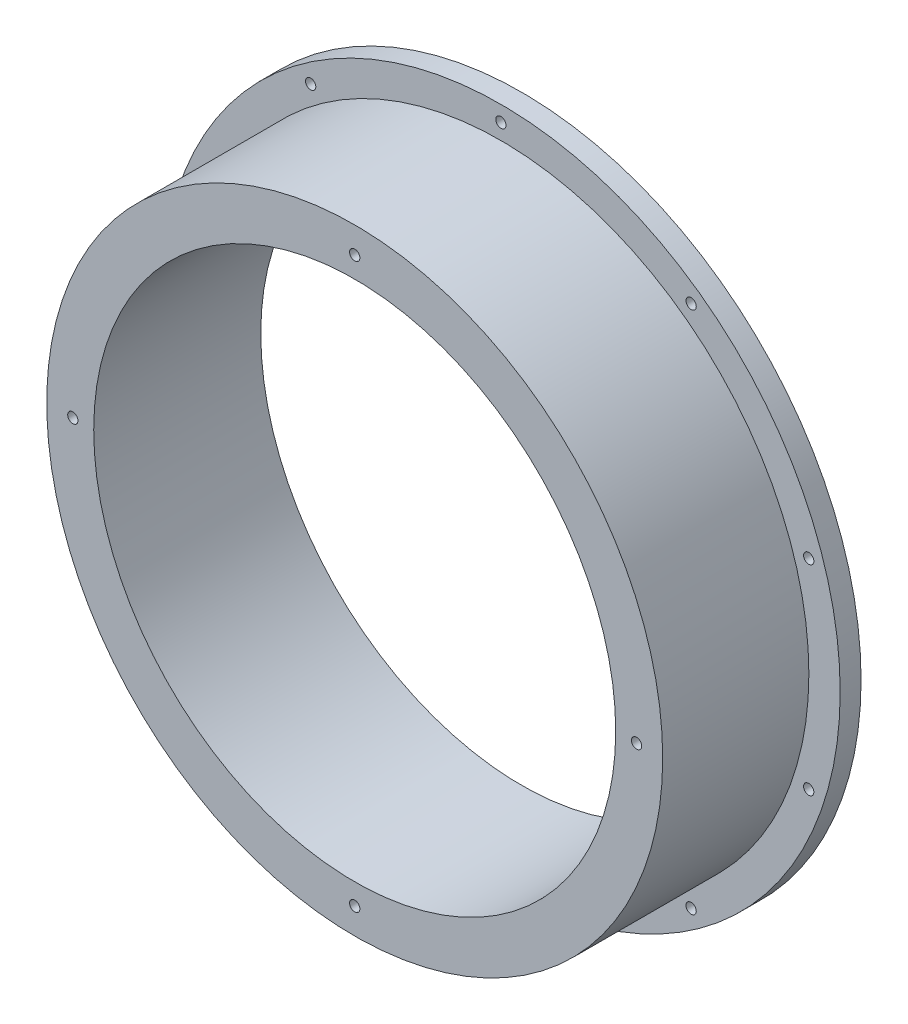
ISO-10303-21;
HEADER;
FILE_DESCRIPTION(('STEP AP214'),'2;1');
FILE_NAME('part.step','',(''),(''),'','','');
FILE_SCHEMA(('AUTOMOTIVE_DESIGN { 1 0 10303 214 1 1 1 1 }'));
ENDSEC;
DATA;
#1=APPLICATION_CONTEXT('core data for automotive mechanical design processes');
#2=APPLICATION_PROTOCOL_DEFINITION('international standard','automotive_design',2000,#1);
#3=PRODUCT_CONTEXT('',#1,'mechanical');
#4=PRODUCT('Part','Part','',(#3));
#5=PRODUCT_RELATED_PRODUCT_CATEGORY('part','',(#4));
#6=PRODUCT_DEFINITION_FORMATION('','',#4);
#7=PRODUCT_DEFINITION_CONTEXT('part definition',#1,'design');
#8=PRODUCT_DEFINITION('design','',#6,#7);
#9=PRODUCT_DEFINITION_SHAPE('','',#8);
#10=(LENGTH_UNIT() NAMED_UNIT(*) SI_UNIT(.MILLI.,.METRE.));
#11=(NAMED_UNIT(*) PLANE_ANGLE_UNIT() SI_UNIT($,.RADIAN.));
#12=(NAMED_UNIT(*) SI_UNIT($,.STERADIAN.) SOLID_ANGLE_UNIT());
#13=UNCERTAINTY_MEASURE_WITH_UNIT(LENGTH_MEASURE(1.E-05),#10,'distance_accuracy_value','');
#14=(GEOMETRIC_REPRESENTATION_CONTEXT(3) GLOBAL_UNCERTAINTY_ASSIGNED_CONTEXT((#13)) GLOBAL_UNIT_ASSIGNED_CONTEXT((#10,
#11,#12)) REPRESENTATION_CONTEXT('',''));
#15=CARTESIAN_POINT('',(0.,0.,0.));
#16=DIRECTION('',(0.,0.,1.));
#17=DIRECTION('',(1.,0.,0.));
#18=AXIS2_PLACEMENT_3D('',#15,#16,#17);
#19=CARTESIAN_POINT('',(0.,0.,0.));
#20=DIRECTION('',(0.,0.,1.));
#21=DIRECTION('',(1.,0.,0.));
#22=AXIS2_PLACEMENT_3D('',#19,#20,#21);
#23=CYLINDRICAL_SURFACE('',#22,82.55);
#24=CARTESIAN_POINT('',(0.,0.,-20.32));
#25=DIRECTION('',(0.,0.,1.));
#26=DIRECTION('',(1.,0.,0.));
#27=AXIS2_PLACEMENT_3D('',#24,#25,#26);
#28=CIRCLE('',#27,82.55);
#29=CARTESIAN_POINT('',(82.55,0.,-20.32));
#30=VERTEX_POINT('',#29);
#31=EDGE_CURVE('E104',#30,#30,#28,.T.);
#32=ORIENTED_EDGE('',*,*,#31,.T.);
#33=EDGE_LOOP('',(#32));
#34=FACE_BOUND('',#33,.T.);
#35=CARTESIAN_POINT('',(0.,0.,-15.24));
#36=DIRECTION('',(0.,0.,1.));
#37=DIRECTION('',(1.,0.,0.));
#38=AXIS2_PLACEMENT_3D('',#35,#36,#37);
#39=CIRCLE('',#38,82.55);
#40=CARTESIAN_POINT('',(82.55,0.,-15.24));
#41=VERTEX_POINT('',#40);
#42=EDGE_CURVE('E11',#41,#41,#39,.T.);
#43=ORIENTED_EDGE('',*,*,#42,.F.);
#44=EDGE_LOOP('',(#43));
#45=FACE_BOUND('',#44,.T.);
#46=ADVANCED_FACE('F42',(#34,#45),#23,.T.);
#47=CARTESIAN_POINT('',(82.55,0.,-15.24));
#48=DIRECTION('',(0.,0.,1.));
#49=DIRECTION('',(1.,0.,0.));
#50=AXIS2_PLACEMENT_3D('',#47,#48,#49);
#51=PLANE('',#50);
#52=CARTESIAN_POINT('',(0.,78.74,-15.24));
#53=DIRECTION('',(0.,0.,1.));
#54=DIRECTION('',(1.,0.,0.));
#55=AXIS2_PLACEMENT_3D('',#52,#53,#54);
#56=CIRCLE('',#55,1.25);
#57=CARTESIAN_POINT('',(1.25,78.74,-15.24));
#58=VERTEX_POINT('',#57);
#59=EDGE_CURVE('E103',#58,#58,#56,.T.);
#60=ORIENTED_EDGE('',*,*,#59,.F.);
#61=EDGE_LOOP('',(#60));
#62=FACE_BOUND('',#61,.T.);
#63=CARTESIAN_POINT('',(46.2822107655093,63.7019981370834,-15.24));
#64=DIRECTION('',(0.,0.,1.));
#65=DIRECTION('',(1.,0.,0.));
#66=AXIS2_PLACEMENT_3D('',#63,#64,#65);
#67=CIRCLE('',#66,1.25);
#68=CARTESIAN_POINT('',(47.5322107655093,63.7019981370834,-15.24));
#69=VERTEX_POINT('',#68);
#70=EDGE_CURVE('E316',#69,#69,#67,.T.);
#71=ORIENTED_EDGE('',*,*,#70,.F.);
#72=EDGE_LOOP('',(#71));
#73=FACE_BOUND('',#72,.T.);
#74=CARTESIAN_POINT('',(74.8861900930804,24.3319981370833,-15.24));
#75=DIRECTION('',(0.,0.,1.));
#76=DIRECTION('',(1.,0.,0.));
#77=AXIS2_PLACEMENT_3D('',#74,#75,#76);
#78=CIRCLE('',#77,1.25);
#79=CARTESIAN_POINT('',(76.1361900930804,24.3319981370833,-15.24));
#80=VERTEX_POINT('',#79);
#81=EDGE_CURVE('E327',#80,#80,#78,.T.);
#82=ORIENTED_EDGE('',*,*,#81,.F.);
#83=EDGE_LOOP('',(#82));
#84=FACE_BOUND('',#83,.T.);
#85=CARTESIAN_POINT('',(74.8861900930804,-24.3319981370834,-15.24));
#86=DIRECTION('',(0.,0.,1.));
#87=DIRECTION('',(1.,0.,0.));
#88=AXIS2_PLACEMENT_3D('',#85,#86,#87);
#89=CIRCLE('',#88,1.25);
#90=CARTESIAN_POINT('',(76.1361900930804,-24.3319981370834,-15.24));
#91=VERTEX_POINT('',#90);
#92=EDGE_CURVE('E341',#91,#91,#89,.T.);
#93=ORIENTED_EDGE('',*,*,#92,.F.);
#94=EDGE_LOOP('',(#93));
#95=FACE_BOUND('',#94,.T.);
#96=CARTESIAN_POINT('',(46.2822107655093,-63.7019981370834,-15.24));
#97=DIRECTION('',(0.,0.,1.));
#98=DIRECTION('',(1.,0.,0.));
#99=AXIS2_PLACEMENT_3D('',#96,#97,#98);
#100=CIRCLE('',#99,1.25);
#101=CARTESIAN_POINT('',(47.5322107655093,-63.7019981370834,-15.24));
#102=VERTEX_POINT('',#101);
#103=EDGE_CURVE('E336',#102,#102,#100,.T.);
#104=ORIENTED_EDGE('',*,*,#103,.F.);
#105=EDGE_LOOP('',(#104));
#106=FACE_BOUND('',#105,.T.);
#107=CARTESIAN_POINT('',(0.,-78.74,-15.24));
#108=DIRECTION('',(0.,0.,1.));
#109=DIRECTION('',(1.,0.,0.));
#110=AXIS2_PLACEMENT_3D('',#107,#108,#109);
#111=CIRCLE('',#110,1.25);
#112=CARTESIAN_POINT('',(1.24999999999999,-78.74,-15.24));
#113=VERTEX_POINT('',#112);
#114=EDGE_CURVE('E134',#113,#113,#111,.T.);
#115=ORIENTED_EDGE('',*,*,#114,.F.);
#116=EDGE_LOOP('',(#115));
#117=FACE_BOUND('',#116,.T.);
#118=CARTESIAN_POINT('',(-46.2822107655093,-63.7019981370833,-15.24));
#119=DIRECTION('',(0.,0.,1.));
#120=DIRECTION('',(1.,0.,0.));
#121=AXIS2_PLACEMENT_3D('',#118,#119,#120);
#122=CIRCLE('',#121,1.25);
#123=CARTESIAN_POINT('',(-45.0322107655093,-63.7019981370833,-15.24));
#124=VERTEX_POINT('',#123);
#125=EDGE_CURVE('E128',#124,#124,#122,.T.);
#126=ORIENTED_EDGE('',*,*,#125,.F.);
#127=EDGE_LOOP('',(#126));
#128=FACE_BOUND('',#127,.T.);
#129=CARTESIAN_POINT('',(-74.8861900930804,-24.3319981370834,-15.24));
#130=DIRECTION('',(0.,0.,1.));
#131=DIRECTION('',(1.,0.,0.));
#132=AXIS2_PLACEMENT_3D('',#129,#130,#131);
#133=CIRCLE('',#132,1.25);
#134=CARTESIAN_POINT('',(-73.6361900930804,-24.3319981370834,-15.24));
#135=VERTEX_POINT('',#134);
#136=EDGE_CURVE('E118',#135,#135,#133,.T.);
#137=ORIENTED_EDGE('',*,*,#136,.F.);
#138=EDGE_LOOP('',(#137));
#139=FACE_BOUND('',#138,.T.);
#140=CARTESIAN_POINT('',(-74.8861900930804,24.3319981370834,-15.24));
#141=DIRECTION('',(0.,0.,1.));
#142=DIRECTION('',(1.,0.,0.));
#143=AXIS2_PLACEMENT_3D('',#140,#141,#142);
#144=CIRCLE('',#143,1.25);
#145=CARTESIAN_POINT('',(-73.6361900930804,24.3319981370834,-15.24));
#146=VERTEX_POINT('',#145);
#147=EDGE_CURVE('E125',#146,#146,#144,.T.);
#148=ORIENTED_EDGE('',*,*,#147,.F.);
#149=EDGE_LOOP('',(#148));
#150=FACE_BOUND('',#149,.T.);
#151=CARTESIAN_POINT('',(-46.2822107655093,63.7019981370834,-15.24));
#152=DIRECTION('',(0.,0.,1.));
#153=DIRECTION('',(1.,0.,0.));
#154=AXIS2_PLACEMENT_3D('',#151,#152,#153);
#155=CIRCLE('',#154,1.25);
#156=CARTESIAN_POINT('',(-45.0322107655093,63.7019981370834,-15.24));
#157=VERTEX_POINT('',#156);
#158=EDGE_CURVE('E166',#157,#157,#155,.T.);
#159=ORIENTED_EDGE('',*,*,#158,.F.);
#160=EDGE_LOOP('',(#159));
#161=FACE_BOUND('',#160,.T.);
#162=ORIENTED_EDGE('',*,*,#42,.T.);
#163=EDGE_LOOP('',(#162));
#164=FACE_BOUND('',#163,.T.);
#165=CARTESIAN_POINT('',(0.,0.,-15.24));
#166=DIRECTION('',(0.,0.,1.));
#167=DIRECTION('',(1.,0.,0.));
#168=AXIS2_PLACEMENT_3D('',#165,#166,#167);
#169=CIRCLE('',#168,74.93);
#170=CARTESIAN_POINT('',(74.93,0.,-15.24));
#171=VERTEX_POINT('',#170);
#172=EDGE_CURVE('E52',#171,#171,#169,.T.);
#173=ORIENTED_EDGE('',*,*,#172,.F.);
#174=EDGE_LOOP('',(#173));
#175=FACE_BOUND('',#174,.T.);
#176=ADVANCED_FACE('F198',(#62,#73,#84,#95,#106,#117,#128,#139,#150,#161,#164,#175),#51,.T.);
#177=CARTESIAN_POINT('',(0.,0.,0.));
#178=DIRECTION('',(0.,0.,1.));
#179=DIRECTION('',(1.,0.,0.));
#180=AXIS2_PLACEMENT_3D('',#177,#178,#179);
#181=CYLINDRICAL_SURFACE('',#180,74.93);
#182=ORIENTED_EDGE('',*,*,#172,.T.);
#183=EDGE_LOOP('',(#182));
#184=FACE_BOUND('',#183,.T.);
#185=CARTESIAN_POINT('',(0.,0.,20.32));
#186=DIRECTION('',(0.,0.,1.));
#187=DIRECTION('',(1.,0.,0.));
#188=AXIS2_PLACEMENT_3D('',#185,#186,#187);
#189=CIRCLE('',#188,74.93);
#190=CARTESIAN_POINT('',(74.93,0.,20.32));
#191=VERTEX_POINT('',#190);
#192=EDGE_CURVE('E60',#191,#191,#189,.T.);
#193=ORIENTED_EDGE('',*,*,#192,.F.);
#194=EDGE_LOOP('',(#193));
#195=FACE_BOUND('',#194,.T.);
#196=ADVANCED_FACE('F202',(#184,#195),#181,.T.);
#197=CARTESIAN_POINT('',(74.93,0.,20.32));
#198=DIRECTION('',(0.,0.,1.));
#199=DIRECTION('',(1.,0.,0.));
#200=AXIS2_PLACEMENT_3D('',#197,#198,#199);
#201=PLANE('',#200);
#202=CARTESIAN_POINT('',(0.,68.58,20.32));
#203=DIRECTION('',(0.,0.,1.));
#204=DIRECTION('',(1.,0.,0.));
#205=AXIS2_PLACEMENT_3D('',#202,#203,#204);
#206=CIRCLE('',#205,1.25);
#207=CARTESIAN_POINT('',(1.25,68.58,20.32));
#208=VERTEX_POINT('',#207);
#209=EDGE_CURVE('E365',#208,#208,#206,.T.);
#210=ORIENTED_EDGE('',*,*,#209,.F.);
#211=EDGE_LOOP('',(#210));
#212=FACE_BOUND('',#211,.T.);
#213=CARTESIAN_POINT('',(68.58,0.,20.32));
#214=DIRECTION('',(0.,0.,1.));
#215=DIRECTION('',(1.,0.,0.));
#216=AXIS2_PLACEMENT_3D('',#213,#214,#215);
#217=CIRCLE('',#216,1.25);
#218=CARTESIAN_POINT('',(69.83,0.,20.32));
#219=VERTEX_POINT('',#218);
#220=EDGE_CURVE('E81',#219,#219,#217,.T.);
#221=ORIENTED_EDGE('',*,*,#220,.F.);
#222=EDGE_LOOP('',(#221));
#223=FACE_BOUND('',#222,.T.);
#224=CARTESIAN_POINT('',(0.,-68.58,20.32));
#225=DIRECTION('',(0.,0.,1.));
#226=DIRECTION('',(1.,0.,0.));
#227=AXIS2_PLACEMENT_3D('',#224,#225,#226);
#228=CIRCLE('',#227,1.25);
#229=CARTESIAN_POINT('',(1.25000000000003,-68.58,20.32));
#230=VERTEX_POINT('',#229);
#231=EDGE_CURVE('E82',#230,#230,#228,.T.);
#232=ORIENTED_EDGE('',*,*,#231,.F.);
#233=EDGE_LOOP('',(#232));
#234=FACE_BOUND('',#233,.T.);
#235=CARTESIAN_POINT('',(-68.58,0.,20.32));
#236=DIRECTION('',(0.,0.,1.));
#237=DIRECTION('',(1.,0.,0.));
#238=AXIS2_PLACEMENT_3D('',#235,#236,#237);
#239=CIRCLE('',#238,1.25);
#240=CARTESIAN_POINT('',(-67.33,0.,20.32));
#241=VERTEX_POINT('',#240);
#242=EDGE_CURVE('E98',#241,#241,#239,.T.);
#243=ORIENTED_EDGE('',*,*,#242,.F.);
#244=EDGE_LOOP('',(#243));
#245=FACE_BOUND('',#244,.T.);
#246=ORIENTED_EDGE('',*,*,#192,.T.);
#247=EDGE_LOOP('',(#246));
#248=FACE_BOUND('',#247,.T.);
#249=CARTESIAN_POINT('',(0.,0.,20.32));
#250=DIRECTION('',(0.,0.,1.));
#251=DIRECTION('',(1.,0.,0.));
#252=AXIS2_PLACEMENT_3D('',#249,#250,#251);
#253=CIRCLE('',#252,63.5);
#254=CARTESIAN_POINT('',(63.5,0.,20.32));
#255=VERTEX_POINT('',#254);
#256=EDGE_CURVE('E388',#255,#255,#253,.T.);
#257=ORIENTED_EDGE('',*,*,#256,.F.);
#258=EDGE_LOOP('',(#257));
#259=FACE_BOUND('',#258,.T.);
#260=ADVANCED_FACE('F207',(#212,#223,#234,#245,#248,#259),#201,.T.);
#261=CARTESIAN_POINT('',(0.,0.,0.));
#262=DIRECTION('',(0.,0.,1.));
#263=DIRECTION('',(1.,0.,0.));
#264=AXIS2_PLACEMENT_3D('',#261,#262,#263);
#265=CYLINDRICAL_SURFACE('',#264,63.5);
#266=ORIENTED_EDGE('',*,*,#256,.T.);
#267=EDGE_LOOP('',(#266));
#268=FACE_BOUND('',#267,.T.);
#269=CARTESIAN_POINT('',(0.,0.,-20.32));
#270=DIRECTION('',(0.,0.,1.));
#271=DIRECTION('',(1.,0.,0.));
#272=AXIS2_PLACEMENT_3D('',#269,#270,#271);
#273=CIRCLE('',#272,63.5);
#274=CARTESIAN_POINT('',(63.5,0.,-20.32));
#275=VERTEX_POINT('',#274);
#276=EDGE_CURVE('E108',#275,#275,#273,.T.);
#277=ORIENTED_EDGE('',*,*,#276,.F.);
#278=EDGE_LOOP('',(#277));
#279=FACE_BOUND('',#278,.T.);
#280=ADVANCED_FACE('F188',(#268,#279),#265,.F.);
#281=CARTESIAN_POINT('',(63.5,0.,-20.32));
#282=DIRECTION('',(0.,0.,-1.));
#283=DIRECTION('',(-1.,0.,0.));
#284=AXIS2_PLACEMENT_3D('',#281,#282,#283);
#285=PLANE('',#284);
#286=CARTESIAN_POINT('',(0.,78.74,-20.32));
#287=DIRECTION('',(0.,0.,-1.));
#288=DIRECTION('',(-1.,0.,0.));
#289=AXIS2_PLACEMENT_3D('',#286,#287,#288);
#290=CIRCLE('',#289,1.25);
#291=CARTESIAN_POINT('',(-1.25,78.74,-20.32));
#292=VERTEX_POINT('',#291);
#293=EDGE_CURVE('E46',#292,#292,#290,.T.);
#294=ORIENTED_EDGE('',*,*,#293,.F.);
#295=EDGE_LOOP('',(#294));
#296=FACE_BOUND('',#295,.T.);
#297=CARTESIAN_POINT('',(46.2822107655093,63.7019981370834,-20.32));
#298=DIRECTION('',(0.,0.,-1.));
#299=DIRECTION('',(-1.,0.,0.));
#300=AXIS2_PLACEMENT_3D('',#297,#298,#299);
#301=CIRCLE('',#300,1.25);
#302=CARTESIAN_POINT('',(45.0322107655093,63.7019981370834,-20.32));
#303=VERTEX_POINT('',#302);
#304=EDGE_CURVE('E322',#303,#303,#301,.T.);
#305=ORIENTED_EDGE('',*,*,#304,.F.);
#306=EDGE_LOOP('',(#305));
#307=FACE_BOUND('',#306,.T.);
#308=CARTESIAN_POINT('',(74.8861900930804,24.3319981370833,-20.32));
#309=DIRECTION('',(0.,0.,-1.));
#310=DIRECTION('',(-1.,0.,0.));
#311=AXIS2_PLACEMENT_3D('',#308,#309,#310);
#312=CIRCLE('',#311,1.25);
#313=CARTESIAN_POINT('',(73.6361900930804,24.3319981370833,-20.32));
#314=VERTEX_POINT('',#313);
#315=EDGE_CURVE('E345',#314,#314,#312,.T.);
#316=ORIENTED_EDGE('',*,*,#315,.F.);
#317=EDGE_LOOP('',(#316));
#318=FACE_BOUND('',#317,.T.);
#319=CARTESIAN_POINT('',(74.8861900930804,-24.3319981370834,-20.32));
#320=DIRECTION('',(0.,0.,-1.));
#321=DIRECTION('',(-1.,0.,0.));
#322=AXIS2_PLACEMENT_3D('',#319,#320,#321);
#323=CIRCLE('',#322,1.25);
#324=CARTESIAN_POINT('',(73.6361900930804,-24.3319981370834,-20.32));
#325=VERTEX_POINT('',#324);
#326=EDGE_CURVE('E340',#325,#325,#323,.T.);
#327=ORIENTED_EDGE('',*,*,#326,.F.);
#328=EDGE_LOOP('',(#327));
#329=FACE_BOUND('',#328,.T.);
#330=CARTESIAN_POINT('',(46.2822107655093,-63.7019981370834,-20.32));
#331=DIRECTION('',(0.,0.,-1.));
#332=DIRECTION('',(-1.,0.,0.));
#333=AXIS2_PLACEMENT_3D('',#330,#331,#332);
#334=CIRCLE('',#333,1.25);
#335=CARTESIAN_POINT('',(45.0322107655093,-63.7019981370834,-20.32));
#336=VERTEX_POINT('',#335);
#337=EDGE_CURVE('E155',#336,#336,#334,.T.);
#338=ORIENTED_EDGE('',*,*,#337,.F.);
#339=EDGE_LOOP('',(#338));
#340=FACE_BOUND('',#339,.T.);
#341=CARTESIAN_POINT('',(0.,-78.74,-20.32));
#342=DIRECTION('',(0.,0.,-1.));
#343=DIRECTION('',(-1.,0.,0.));
#344=AXIS2_PLACEMENT_3D('',#341,#342,#343);
#345=CIRCLE('',#344,1.25);
#346=CARTESIAN_POINT('',(-1.25000000000001,-78.74,-20.32));
#347=VERTEX_POINT('',#346);
#348=EDGE_CURVE('E133',#347,#347,#345,.T.);
#349=ORIENTED_EDGE('',*,*,#348,.F.);
#350=EDGE_LOOP('',(#349));
#351=FACE_BOUND('',#350,.T.);
#352=CARTESIAN_POINT('',(-46.2822107655093,-63.7019981370833,-20.32));
#353=DIRECTION('',(0.,0.,-1.));
#354=DIRECTION('',(-1.,0.,0.));
#355=AXIS2_PLACEMENT_3D('',#352,#353,#354);
#356=CIRCLE('',#355,1.25);
#357=CARTESIAN_POINT('',(-47.5322107655094,-63.7019981370833,-20.32));
#358=VERTEX_POINT('',#357);
#359=EDGE_CURVE('E123',#358,#358,#356,.T.);
#360=ORIENTED_EDGE('',*,*,#359,.F.);
#361=EDGE_LOOP('',(#360));
#362=FACE_BOUND('',#361,.T.);
#363=CARTESIAN_POINT('',(-74.8861900930804,-24.3319981370834,-20.32));
#364=DIRECTION('',(0.,0.,-1.));
#365=DIRECTION('',(-1.,0.,0.));
#366=AXIS2_PLACEMENT_3D('',#363,#364,#365);
#367=CIRCLE('',#366,1.25);
#368=CARTESIAN_POINT('',(-76.1361900930804,-24.3319981370834,-20.32));
#369=VERTEX_POINT('',#368);
#370=EDGE_CURVE('E124',#369,#369,#367,.T.);
#371=ORIENTED_EDGE('',*,*,#370,.F.);
#372=EDGE_LOOP('',(#371));
#373=FACE_BOUND('',#372,.T.);
#374=CARTESIAN_POINT('',(-74.8861900930804,24.3319981370834,-20.32));
#375=DIRECTION('',(0.,0.,-1.));
#376=DIRECTION('',(-1.,0.,0.));
#377=AXIS2_PLACEMENT_3D('',#374,#375,#376);
#378=CIRCLE('',#377,1.25);
#379=CARTESIAN_POINT('',(-76.1361900930804,24.3319981370834,-20.32));
#380=VERTEX_POINT('',#379);
#381=EDGE_CURVE('E162',#380,#380,#378,.T.);
#382=ORIENTED_EDGE('',*,*,#381,.F.);
#383=EDGE_LOOP('',(#382));
#384=FACE_BOUND('',#383,.T.);
#385=CARTESIAN_POINT('',(-46.2822107655093,63.7019981370834,-20.32));
#386=DIRECTION('',(0.,0.,-1.));
#387=DIRECTION('',(-1.,0.,0.));
#388=AXIS2_PLACEMENT_3D('',#385,#386,#387);
#389=CIRCLE('',#388,1.25);
#390=CARTESIAN_POINT('',(-47.5322107655093,63.7019981370834,-20.32));
#391=VERTEX_POINT('',#390);
#392=EDGE_CURVE('E66',#391,#391,#389,.T.);
#393=ORIENTED_EDGE('',*,*,#392,.F.);
#394=EDGE_LOOP('',(#393));
#395=FACE_BOUND('',#394,.T.);
#396=ORIENTED_EDGE('',*,*,#276,.T.);
#397=EDGE_LOOP('',(#396));
#398=FACE_BOUND('',#397,.T.);
#399=ORIENTED_EDGE('',*,*,#31,.F.);
#400=EDGE_LOOP('',(#399));
#401=FACE_BOUND('',#400,.T.);
#402=ADVANCED_FACE('F184',(#296,#307,#318,#329,#340,#351,#362,#373,#384,#395,#398,#401),#285,.T.);
#403=CARTESIAN_POINT('',(-68.58,0.,16.32));
#404=DIRECTION('',(0.,0.,1.));
#405=DIRECTION('',(1.,0.,0.));
#406=AXIS2_PLACEMENT_3D('',#403,#404,#405);
#407=CYLINDRICAL_SURFACE('',#406,1.25);
#408=CARTESIAN_POINT('',(-68.58,0.,16.32));
#409=DIRECTION('',(0.,0.,1.));
#410=DIRECTION('',(1.,0.,0.));
#411=AXIS2_PLACEMENT_3D('',#408,#409,#410);
#412=CIRCLE('',#411,1.25);
#413=CARTESIAN_POINT('',(-67.33,0.,16.32));
#414=VERTEX_POINT('',#413);
#415=EDGE_CURVE('E89',#414,#414,#412,.T.);
#416=ORIENTED_EDGE('',*,*,#415,.F.);
#417=EDGE_LOOP('',(#416));
#418=FACE_BOUND('',#417,.T.);
#419=ORIENTED_EDGE('',*,*,#242,.T.);
#420=EDGE_LOOP('',(#419));
#421=FACE_BOUND('',#420,.T.);
#422=ADVANCED_FACE('F187',(#418,#421),#407,.F.);
#423=CARTESIAN_POINT('',(-68.58,0.,16.32));
#424=DIRECTION('',(0.,0.,1.));
#425=DIRECTION('',(1.,0.,0.));
#426=AXIS2_PLACEMENT_3D('',#423,#424,#425);
#427=PLANE('',#426);
#428=ORIENTED_EDGE('',*,*,#415,.T.);
#429=EDGE_LOOP('',(#428));
#430=FACE_BOUND('',#429,.T.);
#431=ADVANCED_FACE('F233',(#430),#427,.T.);
#432=CARTESIAN_POINT('',(0.,-68.58,16.32));
#433=DIRECTION('',(0.,0.,1.));
#434=DIRECTION('',(1.,0.,0.));
#435=AXIS2_PLACEMENT_3D('',#432,#433,#434);
#436=CYLINDRICAL_SURFACE('',#435,1.25);
#437=CARTESIAN_POINT('',(0.,-68.58,16.32));
#438=DIRECTION('',(0.,0.,1.));
#439=DIRECTION('',(1.,0.,0.));
#440=AXIS2_PLACEMENT_3D('',#437,#438,#439);
#441=CIRCLE('',#440,1.25);
#442=CARTESIAN_POINT('',(1.25000000000003,-68.58,16.32));
#443=VERTEX_POINT('',#442);
#444=EDGE_CURVE('E75',#443,#443,#441,.T.);
#445=ORIENTED_EDGE('',*,*,#444,.F.);
#446=EDGE_LOOP('',(#445));
#447=FACE_BOUND('',#446,.T.);
#448=ORIENTED_EDGE('',*,*,#231,.T.);
#449=EDGE_LOOP('',(#448));
#450=FACE_BOUND('',#449,.T.);
#451=ADVANCED_FACE('F239',(#447,#450),#436,.F.);
#452=CARTESIAN_POINT('',(0.,-68.58,16.32));
#453=DIRECTION('',(0.,0.,1.));
#454=DIRECTION('',(1.,0.,0.));
#455=AXIS2_PLACEMENT_3D('',#452,#453,#454);
#456=PLANE('',#455);
#457=ORIENTED_EDGE('',*,*,#444,.T.);
#458=EDGE_LOOP('',(#457));
#459=FACE_BOUND('',#458,.T.);
#460=ADVANCED_FACE('F244',(#459),#456,.T.);
#461=CARTESIAN_POINT('',(68.58,0.,16.32));
#462=DIRECTION('',(0.,0.,1.));
#463=DIRECTION('',(1.,0.,0.));
#464=AXIS2_PLACEMENT_3D('',#461,#462,#463);
#465=CYLINDRICAL_SURFACE('',#464,1.25);
#466=CARTESIAN_POINT('',(68.58,0.,16.32));
#467=DIRECTION('',(0.,0.,1.));
#468=DIRECTION('',(1.,0.,0.));
#469=AXIS2_PLACEMENT_3D('',#466,#467,#468);
#470=CIRCLE('',#469,1.25);
#471=CARTESIAN_POINT('',(69.83,0.,16.32));
#472=VERTEX_POINT('',#471);
#473=EDGE_CURVE('E361',#472,#472,#470,.T.);
#474=ORIENTED_EDGE('',*,*,#473,.F.);
#475=EDGE_LOOP('',(#474));
#476=FACE_BOUND('',#475,.T.);
#477=ORIENTED_EDGE('',*,*,#220,.T.);
#478=EDGE_LOOP('',(#477));
#479=FACE_BOUND('',#478,.T.);
#480=ADVANCED_FACE('F249',(#476,#479),#465,.F.);
#481=CARTESIAN_POINT('',(68.58,0.,16.32));
#482=DIRECTION('',(0.,0.,1.));
#483=DIRECTION('',(1.,0.,0.));
#484=AXIS2_PLACEMENT_3D('',#481,#482,#483);
#485=PLANE('',#484);
#486=ORIENTED_EDGE('',*,*,#473,.T.);
#487=EDGE_LOOP('',(#486));
#488=FACE_BOUND('',#487,.T.);
#489=ADVANCED_FACE('F254',(#488),#485,.T.);
#490=CARTESIAN_POINT('',(0.,68.58,16.32));
#491=DIRECTION('',(0.,0.,1.));
#492=DIRECTION('',(1.,0.,0.));
#493=AXIS2_PLACEMENT_3D('',#490,#491,#492);
#494=CYLINDRICAL_SURFACE('',#493,1.25);
#495=CARTESIAN_POINT('',(0.,68.58,16.32));
#496=DIRECTION('',(0.,0.,1.));
#497=DIRECTION('',(1.,0.,0.));
#498=AXIS2_PLACEMENT_3D('',#495,#496,#497);
#499=CIRCLE('',#498,1.25);
#500=CARTESIAN_POINT('',(1.25,68.58,16.32));
#501=VERTEX_POINT('',#500);
#502=EDGE_CURVE('E109',#501,#501,#499,.T.);
#503=ORIENTED_EDGE('',*,*,#502,.F.);
#504=EDGE_LOOP('',(#503));
#505=FACE_BOUND('',#504,.T.);
#506=ORIENTED_EDGE('',*,*,#209,.T.);
#507=EDGE_LOOP('',(#506));
#508=FACE_BOUND('',#507,.T.);
#509=ADVANCED_FACE('F258',(#505,#508),#494,.F.);
#510=CARTESIAN_POINT('',(0.,68.58,16.32));
#511=DIRECTION('',(0.,0.,1.));
#512=DIRECTION('',(1.,0.,0.));
#513=AXIS2_PLACEMENT_3D('',#510,#511,#512);
#514=PLANE('',#513);
#515=ORIENTED_EDGE('',*,*,#502,.T.);
#516=EDGE_LOOP('',(#515));
#517=FACE_BOUND('',#516,.T.);
#518=ADVANCED_FACE('F263',(#517),#514,.T.);
#519=CARTESIAN_POINT('',(-46.2822107655093,63.7019981370834,20.32));
#520=DIRECTION('',(0.,0.,-1.));
#521=DIRECTION('',(-1.,0.,0.));
#522=AXIS2_PLACEMENT_3D('',#519,#520,#521);
#523=CYLINDRICAL_SURFACE('',#522,1.25);
#524=ORIENTED_EDGE('',*,*,#158,.T.);
#525=EDGE_LOOP('',(#524));
#526=FACE_BOUND('',#525,.T.);
#527=ORIENTED_EDGE('',*,*,#392,.T.);
#528=EDGE_LOOP('',(#527));
#529=FACE_BOUND('',#528,.T.);
#530=ADVANCED_FACE('F182',(#526,#529),#523,.F.);
#531=CARTESIAN_POINT('',(-74.8861900930804,24.3319981370834,20.32));
#532=DIRECTION('',(0.,0.,-1.));
#533=DIRECTION('',(-1.,0.,0.));
#534=AXIS2_PLACEMENT_3D('',#531,#532,#533);
#535=CYLINDRICAL_SURFACE('',#534,1.25);
#536=ORIENTED_EDGE('',*,*,#147,.T.);
#537=EDGE_LOOP('',(#536));
#538=FACE_BOUND('',#537,.T.);
#539=ORIENTED_EDGE('',*,*,#381,.T.);
#540=EDGE_LOOP('',(#539));
#541=FACE_BOUND('',#540,.T.);
#542=ADVANCED_FACE('F297',(#538,#541),#535,.F.);
#543=CARTESIAN_POINT('',(-74.8861900930804,-24.3319981370834,20.32));
#544=DIRECTION('',(0.,0.,-1.));
#545=DIRECTION('',(-1.,0.,0.));
#546=AXIS2_PLACEMENT_3D('',#543,#544,#545);
#547=CYLINDRICAL_SURFACE('',#546,1.25);
#548=ORIENTED_EDGE('',*,*,#136,.T.);
#549=EDGE_LOOP('',(#548));
#550=FACE_BOUND('',#549,.T.);
#551=ORIENTED_EDGE('',*,*,#370,.T.);
#552=EDGE_LOOP('',(#551));
#553=FACE_BOUND('',#552,.T.);
#554=ADVANCED_FACE('F293',(#550,#553),#547,.F.);
#555=CARTESIAN_POINT('',(-46.2822107655093,-63.7019981370833,20.32));
#556=DIRECTION('',(0.,0.,-1.));
#557=DIRECTION('',(-1.,0.,0.));
#558=AXIS2_PLACEMENT_3D('',#555,#556,#557);
#559=CYLINDRICAL_SURFACE('',#558,1.25);
#560=ORIENTED_EDGE('',*,*,#125,.T.);
#561=EDGE_LOOP('',(#560));
#562=FACE_BOUND('',#561,.T.);
#563=ORIENTED_EDGE('',*,*,#359,.T.);
#564=EDGE_LOOP('',(#563));
#565=FACE_BOUND('',#564,.T.);
#566=ADVANCED_FACE('F288',(#562,#565),#559,.F.);
#567=CARTESIAN_POINT('',(0.,-78.74,20.32));
#568=DIRECTION('',(0.,0.,-1.));
#569=DIRECTION('',(-1.,0.,0.));
#570=AXIS2_PLACEMENT_3D('',#567,#568,#569);
#571=CYLINDRICAL_SURFACE('',#570,1.25);
#572=ORIENTED_EDGE('',*,*,#114,.T.);
#573=EDGE_LOOP('',(#572));
#574=FACE_BOUND('',#573,.T.);
#575=ORIENTED_EDGE('',*,*,#348,.T.);
#576=EDGE_LOOP('',(#575));
#577=FACE_BOUND('',#576,.T.);
#578=ADVANCED_FACE('F284',(#574,#577),#571,.F.);
#579=CARTESIAN_POINT('',(46.2822107655093,-63.7019981370834,20.32));
#580=DIRECTION('',(0.,0.,-1.));
#581=DIRECTION('',(-1.,0.,0.));
#582=AXIS2_PLACEMENT_3D('',#579,#580,#581);
#583=CYLINDRICAL_SURFACE('',#582,1.25);
#584=ORIENTED_EDGE('',*,*,#103,.T.);
#585=EDGE_LOOP('',(#584));
#586=FACE_BOUND('',#585,.T.);
#587=ORIENTED_EDGE('',*,*,#337,.T.);
#588=EDGE_LOOP('',(#587));
#589=FACE_BOUND('',#588,.T.);
#590=ADVANCED_FACE('F278',(#586,#589),#583,.F.);
#591=CARTESIAN_POINT('',(74.8861900930804,-24.3319981370834,20.32));
#592=DIRECTION('',(0.,0.,-1.));
#593=DIRECTION('',(-1.,0.,0.));
#594=AXIS2_PLACEMENT_3D('',#591,#592,#593);
#595=CYLINDRICAL_SURFACE('',#594,1.25);
#596=ORIENTED_EDGE('',*,*,#92,.T.);
#597=EDGE_LOOP('',(#596));
#598=FACE_BOUND('',#597,.T.);
#599=ORIENTED_EDGE('',*,*,#326,.T.);
#600=EDGE_LOOP('',(#599));
#601=FACE_BOUND('',#600,.T.);
#602=ADVANCED_FACE('F273',(#598,#601),#595,.F.);
#603=CARTESIAN_POINT('',(74.8861900930804,24.3319981370833,20.32));
#604=DIRECTION('',(0.,0.,-1.));
#605=DIRECTION('',(-1.,0.,0.));
#606=AXIS2_PLACEMENT_3D('',#603,#604,#605);
#607=CYLINDRICAL_SURFACE('',#606,1.25);
#608=ORIENTED_EDGE('',*,*,#81,.T.);
#609=EDGE_LOOP('',(#608));
#610=FACE_BOUND('',#609,.T.);
#611=ORIENTED_EDGE('',*,*,#315,.T.);
#612=EDGE_LOOP('',(#611));
#613=FACE_BOUND('',#612,.T.);
#614=ADVANCED_FACE('F269',(#610,#613),#607,.F.);
#615=CARTESIAN_POINT('',(46.2822107655093,63.7019981370834,20.32));
#616=DIRECTION('',(0.,0.,-1.));
#617=DIRECTION('',(-1.,0.,0.));
#618=AXIS2_PLACEMENT_3D('',#615,#616,#617);
#619=CYLINDRICAL_SURFACE('',#618,1.25);
#620=ORIENTED_EDGE('',*,*,#70,.T.);
#621=EDGE_LOOP('',(#620));
#622=FACE_BOUND('',#621,.T.);
#623=ORIENTED_EDGE('',*,*,#304,.T.);
#624=EDGE_LOOP('',(#623));
#625=FACE_BOUND('',#624,.T.);
#626=ADVANCED_FACE('F272',(#622,#625),#619,.F.);
#627=CARTESIAN_POINT('',(0.,78.74,20.32));
#628=DIRECTION('',(0.,0.,-1.));
#629=DIRECTION('',(-1.,0.,0.));
#630=AXIS2_PLACEMENT_3D('',#627,#628,#629);
#631=CYLINDRICAL_SURFACE('',#630,1.25);
#632=ORIENTED_EDGE('',*,*,#59,.T.);
#633=EDGE_LOOP('',(#632));
#634=FACE_BOUND('',#633,.T.);
#635=ORIENTED_EDGE('',*,*,#293,.T.);
#636=EDGE_LOOP('',(#635));
#637=FACE_BOUND('',#636,.T.);
#638=ADVANCED_FACE('F306',(#634,#637),#631,.F.);
#639=CLOSED_SHELL('',(#46,#176,#196,#260,#280,#402,#422,#431,#451,#460,#480,#489,#509,#518,#530,
#542,#554,#566,#578,#590,#602,#614,#626,#638));
#640=MANIFOLD_SOLID_BREP('B2',#639);
#641=ADVANCED_BREP_SHAPE_REPRESENTATION('',(#18,#640),#14);
#642=SHAPE_DEFINITION_REPRESENTATION(#9,#641);
ENDSEC;
END-ISO-10303-21;
